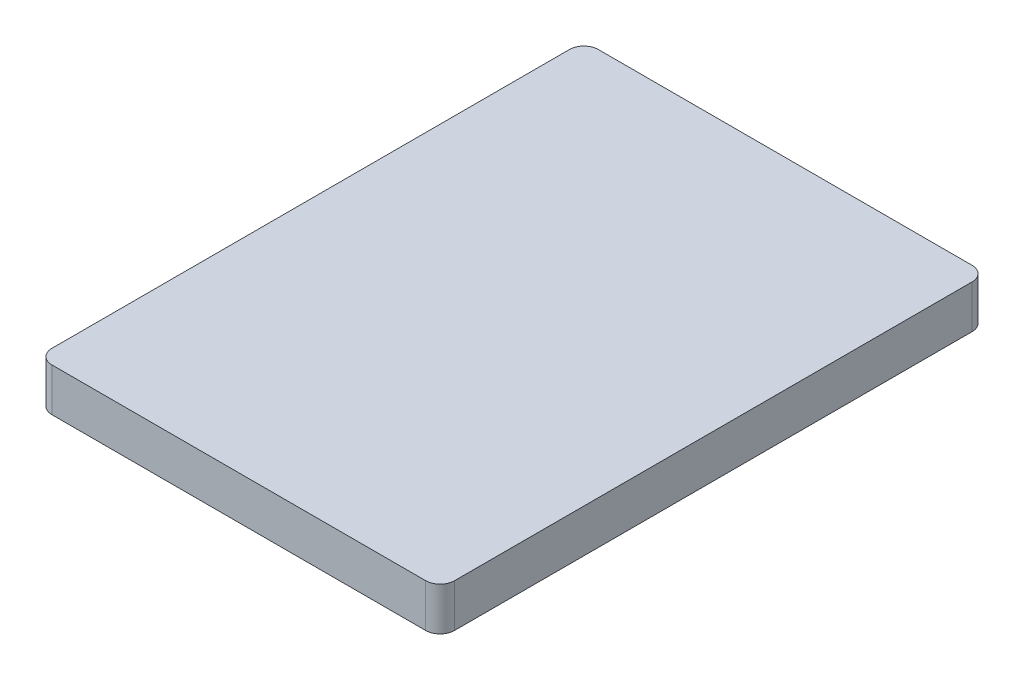
ISO-10303-21;
HEADER;
FILE_DESCRIPTION(('STEP AP214'),'2;1');
FILE_NAME('part.step','',(''),(''),'','','');
FILE_SCHEMA(('AUTOMOTIVE_DESIGN { 1 0 10303 214 1 1 1 1 }'));
ENDSEC;
DATA;
#1=APPLICATION_CONTEXT('core data for automotive mechanical design processes');
#2=APPLICATION_PROTOCOL_DEFINITION('international standard','automotive_design',2000,#1);
#3=PRODUCT_CONTEXT('',#1,'mechanical');
#4=PRODUCT('Part','Part','',(#3));
#5=PRODUCT_RELATED_PRODUCT_CATEGORY('part','',(#4));
#6=PRODUCT_DEFINITION_FORMATION('','',#4);
#7=PRODUCT_DEFINITION_CONTEXT('part definition',#1,'design');
#8=PRODUCT_DEFINITION('design','',#6,#7);
#9=PRODUCT_DEFINITION_SHAPE('','',#8);
#10=(LENGTH_UNIT() NAMED_UNIT(*) SI_UNIT(.MILLI.,.METRE.));
#11=(NAMED_UNIT(*) PLANE_ANGLE_UNIT() SI_UNIT($,.RADIAN.));
#12=(NAMED_UNIT(*) SI_UNIT($,.STERADIAN.) SOLID_ANGLE_UNIT());
#13=UNCERTAINTY_MEASURE_WITH_UNIT(LENGTH_MEASURE(1.E-05),#10,'distance_accuracy_value','');
#14=(GEOMETRIC_REPRESENTATION_CONTEXT(3) GLOBAL_UNCERTAINTY_ASSIGNED_CONTEXT((#13)) GLOBAL_UNIT_ASSIGNED_CONTEXT((#10,
#11,#12)) REPRESENTATION_CONTEXT('',''));
#15=CARTESIAN_POINT('',(0.,0.,0.));
#16=DIRECTION('',(0.,0.,1.));
#17=DIRECTION('',(1.,0.,0.));
#18=AXIS2_PLACEMENT_3D('',#15,#16,#17);
#19=CARTESIAN_POINT('',(0.,6.,76.));
#20=DIRECTION('',(1.,0.,0.));
#21=DIRECTION('',(0.,0.,-1.));
#22=AXIS2_PLACEMENT_3D('',#19,#20,#21);
#23=PLANE('',#22);
#24=DIRECTION('',(0.,0.,-1.));
#25=VECTOR('',#24,1.);
#26=CARTESIAN_POINT('',(0.,6.,76.));
#27=LINE('',#26,#25);
#28=CARTESIAN_POINT('',(0.,6.,74.));
#29=VERTEX_POINT('',#28);
#30=CARTESIAN_POINT('',(0.,6.,2.));
#31=VERTEX_POINT('',#30);
#32=EDGE_CURVE('E160',#29,#31,#27,.T.);
#33=ORIENTED_EDGE('',*,*,#32,.T.);
#34=DIRECTION('',(0.,-1.,0.));
#35=VECTOR('',#34,1.);
#36=CARTESIAN_POINT('',(0.,6.,2.));
#37=LINE('',#36,#35);
#38=CARTESIAN_POINT('',(0.,0.,2.));
#39=VERTEX_POINT('',#38);
#40=EDGE_CURVE('E124',#31,#39,#37,.T.);
#41=ORIENTED_EDGE('',*,*,#40,.T.);
#42=DIRECTION('',(0.,0.,-1.));
#43=VECTOR('',#42,1.);
#44=CARTESIAN_POINT('',(0.,0.,76.));
#45=LINE('',#44,#43);
#46=CARTESIAN_POINT('',(0.,0.,74.));
#47=VERTEX_POINT('',#46);
#48=EDGE_CURVE('E109',#47,#39,#45,.T.);
#49=ORIENTED_EDGE('',*,*,#48,.F.);
#50=DIRECTION('',(0.,-1.,0.));
#51=VECTOR('',#50,1.);
#52=CARTESIAN_POINT('',(0.,6.,74.));
#53=LINE('',#52,#51);
#54=EDGE_CURVE('E121',#47,#29,#53,.F.);
#55=ORIENTED_EDGE('',*,*,#54,.T.);
#56=EDGE_LOOP('',(#33,#41,#49,#55));
#57=FACE_BOUND('',#56,.T.);
#58=ADVANCED_FACE('F39',(#57),#23,.F.);
#59=CARTESIAN_POINT('',(0.,0.,76.));
#60=DIRECTION('',(0.,1.,0.));
#61=DIRECTION('',(0.,0.,1.));
#62=AXIS2_PLACEMENT_3D('',#59,#60,#61);
#63=PLANE('',#62);
#64=ORIENTED_EDGE('',*,*,#48,.T.);
#65=CARTESIAN_POINT('',(2.,0.,2.));
#66=DIRECTION('',(0.,1.,0.));
#67=DIRECTION('',(0.,0.,1.));
#68=AXIS2_PLACEMENT_3D('',#65,#66,#67);
#69=CIRCLE('',#68,2.);
#70=CARTESIAN_POINT('',(2.,0.,0.));
#71=VERTEX_POINT('',#70);
#72=EDGE_CURVE('E136',#39,#71,#69,.F.);
#73=ORIENTED_EDGE('',*,*,#72,.T.);
#74=DIRECTION('',(1.,0.,0.));
#75=VECTOR('',#74,1.);
#76=CARTESIAN_POINT('',(0.,0.,0.));
#77=LINE('',#76,#75);
#78=CARTESIAN_POINT('',(54.,0.,0.));
#79=VERTEX_POINT('',#78);
#80=EDGE_CURVE('E167',#71,#79,#77,.T.);
#81=ORIENTED_EDGE('',*,*,#80,.T.);
#82=CARTESIAN_POINT('',(54.,0.,2.));
#83=DIRECTION('',(0.,1.,0.));
#84=DIRECTION('',(0.,0.,1.));
#85=AXIS2_PLACEMENT_3D('',#82,#83,#84);
#86=CIRCLE('',#85,2.);
#87=CARTESIAN_POINT('',(56.,0.,2.));
#88=VERTEX_POINT('',#87);
#89=EDGE_CURVE('E115',#79,#88,#86,.F.);
#90=ORIENTED_EDGE('',*,*,#89,.T.);
#91=DIRECTION('',(0.,0.,-1.));
#92=VECTOR('',#91,1.);
#93=CARTESIAN_POINT('',(56.,0.,76.));
#94=LINE('',#93,#92);
#95=CARTESIAN_POINT('',(56.,0.,74.));
#96=VERTEX_POINT('',#95);
#97=EDGE_CURVE('E125',#96,#88,#94,.T.);
#98=ORIENTED_EDGE('',*,*,#97,.F.);
#99=CARTESIAN_POINT('',(54.,0.,74.));
#100=DIRECTION('',(0.,1.,0.));
#101=DIRECTION('',(0.,0.,1.));
#102=AXIS2_PLACEMENT_3D('',#99,#100,#101);
#103=CIRCLE('',#102,2.);
#104=CARTESIAN_POINT('',(54.,0.,76.));
#105=VERTEX_POINT('',#104);
#106=EDGE_CURVE('E116',#96,#105,#103,.F.);
#107=ORIENTED_EDGE('',*,*,#106,.T.);
#108=DIRECTION('',(1.,0.,0.));
#109=VECTOR('',#108,1.);
#110=CARTESIAN_POINT('',(0.,0.,76.));
#111=LINE('',#110,#109);
#112=CARTESIAN_POINT('',(2.,0.,76.));
#113=VERTEX_POINT('',#112);
#114=EDGE_CURVE('E111',#113,#105,#111,.T.);
#115=ORIENTED_EDGE('',*,*,#114,.F.);
#116=CARTESIAN_POINT('',(2.,0.,74.));
#117=DIRECTION('',(0.,1.,0.));
#118=DIRECTION('',(0.,0.,1.));
#119=AXIS2_PLACEMENT_3D('',#116,#117,#118);
#120=CIRCLE('',#119,2.);
#121=EDGE_CURVE('E106',#113,#47,#120,.F.);
#122=ORIENTED_EDGE('',*,*,#121,.T.);
#123=EDGE_LOOP('',(#64,#73,#81,#90,#98,#107,#115,#122));
#124=FACE_BOUND('',#123,.T.);
#125=ADVANCED_FACE('F108',(#124),#63,.F.);
#126=CARTESIAN_POINT('',(56.,0.,76.));
#127=DIRECTION('',(-1.,0.,0.));
#128=DIRECTION('',(0.,0.,1.));
#129=AXIS2_PLACEMENT_3D('',#126,#127,#128);
#130=PLANE('',#129);
#131=ORIENTED_EDGE('',*,*,#97,.T.);
#132=DIRECTION('',(0.,1.,0.));
#133=VECTOR('',#132,1.);
#134=CARTESIAN_POINT('',(56.,0.,2.));
#135=LINE('',#134,#133);
#136=CARTESIAN_POINT('',(56.,6.,2.));
#137=VERTEX_POINT('',#136);
#138=EDGE_CURVE('E149',#88,#137,#135,.T.);
#139=ORIENTED_EDGE('',*,*,#138,.T.);
#140=DIRECTION('',(0.,0.,-1.));
#141=VECTOR('',#140,1.);
#142=CARTESIAN_POINT('',(56.,6.,76.));
#143=LINE('',#142,#141);
#144=CARTESIAN_POINT('',(56.,6.,74.));
#145=VERTEX_POINT('',#144);
#146=EDGE_CURVE('E162',#145,#137,#143,.T.);
#147=ORIENTED_EDGE('',*,*,#146,.F.);
#148=DIRECTION('',(0.,1.,0.));
#149=VECTOR('',#148,1.);
#150=CARTESIAN_POINT('',(56.,0.,74.));
#151=LINE('',#150,#149);
#152=EDGE_CURVE('E147',#145,#96,#151,.F.);
#153=ORIENTED_EDGE('',*,*,#152,.T.);
#154=EDGE_LOOP('',(#131,#139,#147,#153));
#155=FACE_BOUND('',#154,.T.);
#156=ADVANCED_FACE('F174',(#155),#130,.F.);
#157=CARTESIAN_POINT('',(56.,6.,76.));
#158=DIRECTION('',(0.,-1.,0.));
#159=DIRECTION('',(0.,0.,-1.));
#160=AXIS2_PLACEMENT_3D('',#157,#158,#159);
#161=PLANE('',#160);
#162=DIRECTION('',(-1.,0.,0.));
#163=VECTOR('',#162,1.);
#164=CARTESIAN_POINT('',(56.,6.,0.));
#165=LINE('',#164,#163);
#166=CARTESIAN_POINT('',(54.,6.,0.));
#167=VERTEX_POINT('',#166);
#168=CARTESIAN_POINT('',(2.,6.,0.));
#169=VERTEX_POINT('',#168);
#170=EDGE_CURVE('E164',#167,#169,#165,.T.);
#171=ORIENTED_EDGE('',*,*,#170,.T.);
#172=CARTESIAN_POINT('',(2.,6.,2.));
#173=DIRECTION('',(0.,-1.,0.));
#174=DIRECTION('',(0.,0.,-1.));
#175=AXIS2_PLACEMENT_3D('',#172,#173,#174);
#176=CIRCLE('',#175,2.);
#177=EDGE_CURVE('E145',#169,#31,#176,.F.);
#178=ORIENTED_EDGE('',*,*,#177,.T.);
#179=ORIENTED_EDGE('',*,*,#32,.F.);
#180=CARTESIAN_POINT('',(2.,6.,74.));
#181=DIRECTION('',(0.,-1.,0.));
#182=DIRECTION('',(0.,0.,-1.));
#183=AXIS2_PLACEMENT_3D('',#180,#181,#182);
#184=CIRCLE('',#183,2.);
#185=CARTESIAN_POINT('',(2.,6.,76.));
#186=VERTEX_POINT('',#185);
#187=EDGE_CURVE('E129',#29,#186,#184,.F.);
#188=ORIENTED_EDGE('',*,*,#187,.T.);
#189=DIRECTION('',(-1.,0.,0.));
#190=VECTOR('',#189,1.);
#191=CARTESIAN_POINT('',(56.,6.,76.));
#192=LINE('',#191,#190);
#193=CARTESIAN_POINT('',(54.,6.,76.));
#194=VERTEX_POINT('',#193);
#195=EDGE_CURVE('E155',#194,#186,#192,.T.);
#196=ORIENTED_EDGE('',*,*,#195,.F.);
#197=CARTESIAN_POINT('',(54.,6.,74.));
#198=DIRECTION('',(0.,-1.,0.));
#199=DIRECTION('',(0.,0.,-1.));
#200=AXIS2_PLACEMENT_3D('',#197,#198,#199);
#201=CIRCLE('',#200,2.);
#202=EDGE_CURVE('E62',#194,#145,#201,.F.);
#203=ORIENTED_EDGE('',*,*,#202,.T.);
#204=ORIENTED_EDGE('',*,*,#146,.T.);
#205=CARTESIAN_POINT('',(54.,6.,2.));
#206=DIRECTION('',(0.,-1.,0.));
#207=DIRECTION('',(0.,0.,-1.));
#208=AXIS2_PLACEMENT_3D('',#205,#206,#207);
#209=CIRCLE('',#208,2.);
#210=EDGE_CURVE('E54',#137,#167,#209,.F.);
#211=ORIENTED_EDGE('',*,*,#210,.T.);
#212=EDGE_LOOP('',(#171,#178,#179,#188,#196,#203,#204,#211));
#213=FACE_BOUND('',#212,.T.);
#214=ADVANCED_FACE('F159',(#213),#161,.F.);
#215=CARTESIAN_POINT('',(0.,0.,76.));
#216=DIRECTION('',(0.,0.,1.));
#217=DIRECTION('',(1.,0.,0.));
#218=AXIS2_PLACEMENT_3D('',#215,#216,#217);
#219=PLANE('',#218);
#220=ORIENTED_EDGE('',*,*,#195,.T.);
#221=DIRECTION('',(0.,-1.,0.));
#222=VECTOR('',#221,1.);
#223=CARTESIAN_POINT('',(2.,0.,76.));
#224=LINE('',#223,#222);
#225=EDGE_CURVE('E11',#186,#113,#224,.T.);
#226=ORIENTED_EDGE('',*,*,#225,.T.);
#227=ORIENTED_EDGE('',*,*,#114,.T.);
#228=DIRECTION('',(0.,1.,0.));
#229=VECTOR('',#228,1.);
#230=CARTESIAN_POINT('',(54.,6.,76.));
#231=LINE('',#230,#229);
#232=EDGE_CURVE('E47',#105,#194,#231,.T.);
#233=ORIENTED_EDGE('',*,*,#232,.T.);
#234=EDGE_LOOP('',(#220,#226,#227,#233));
#235=FACE_BOUND('',#234,.T.);
#236=ADVANCED_FACE('F154',(#235),#219,.T.);
#237=CARTESIAN_POINT('',(0.,0.,0.));
#238=DIRECTION('',(0.,0.,1.));
#239=DIRECTION('',(1.,0.,0.));
#240=AXIS2_PLACEMENT_3D('',#237,#238,#239);
#241=PLANE('',#240);
#242=ORIENTED_EDGE('',*,*,#80,.F.);
#243=DIRECTION('',(0.,-1.,0.));
#244=VECTOR('',#243,1.);
#245=CARTESIAN_POINT('',(2.,0.,0.));
#246=LINE('',#245,#244);
#247=EDGE_CURVE('E140',#71,#169,#246,.F.);
#248=ORIENTED_EDGE('',*,*,#247,.T.);
#249=ORIENTED_EDGE('',*,*,#170,.F.);
#250=DIRECTION('',(0.,1.,0.));
#251=VECTOR('',#250,1.);
#252=CARTESIAN_POINT('',(54.,0.,0.));
#253=LINE('',#252,#251);
#254=EDGE_CURVE('E138',#167,#79,#253,.F.);
#255=ORIENTED_EDGE('',*,*,#254,.T.);
#256=EDGE_LOOP('',(#242,#248,#249,#255));
#257=FACE_BOUND('',#256,.T.);
#258=ADVANCED_FACE('F181',(#257),#241,.F.);
#259=CARTESIAN_POINT('',(2.,6.,2.));
#260=DIRECTION('',(0.,-1.,0.));
#261=DIRECTION('',(0.,0.,-1.));
#262=AXIS2_PLACEMENT_3D('',#259,#260,#261);
#263=CYLINDRICAL_SURFACE('',#262,2.);
#264=ORIENTED_EDGE('',*,*,#177,.F.);
#265=ORIENTED_EDGE('',*,*,#247,.F.);
#266=ORIENTED_EDGE('',*,*,#72,.F.);
#267=ORIENTED_EDGE('',*,*,#40,.F.);
#268=EDGE_LOOP('',(#264,#265,#266,#267));
#269=FACE_BOUND('',#268,.T.);
#270=ADVANCED_FACE('F185',(#269),#263,.T.);
#271=CARTESIAN_POINT('',(54.,0.,2.));
#272=DIRECTION('',(0.,1.,0.));
#273=DIRECTION('',(0.,0.,1.));
#274=AXIS2_PLACEMENT_3D('',#271,#272,#273);
#275=CYLINDRICAL_SURFACE('',#274,2.);
#276=ORIENTED_EDGE('',*,*,#89,.F.);
#277=ORIENTED_EDGE('',*,*,#254,.F.);
#278=ORIENTED_EDGE('',*,*,#210,.F.);
#279=ORIENTED_EDGE('',*,*,#138,.F.);
#280=EDGE_LOOP('',(#276,#277,#278,#279));
#281=FACE_BOUND('',#280,.T.);
#282=ADVANCED_FACE('F177',(#281),#275,.T.);
#283=CARTESIAN_POINT('',(2.,0.,74.));
#284=DIRECTION('',(0.,1.,0.));
#285=DIRECTION('',(0.,0.,1.));
#286=AXIS2_PLACEMENT_3D('',#283,#284,#285);
#287=CYLINDRICAL_SURFACE('',#286,2.);
#288=ORIENTED_EDGE('',*,*,#187,.F.);
#289=ORIENTED_EDGE('',*,*,#54,.F.);
#290=ORIENTED_EDGE('',*,*,#121,.F.);
#291=ORIENTED_EDGE('',*,*,#225,.F.);
#292=EDGE_LOOP('',(#288,#289,#290,#291));
#293=FACE_BOUND('',#292,.T.);
#294=ADVANCED_FACE('F128',(#293),#287,.T.);
#295=CARTESIAN_POINT('',(54.,0.,74.));
#296=DIRECTION('',(0.,-1.,0.));
#297=DIRECTION('',(0.,0.,-1.));
#298=AXIS2_PLACEMENT_3D('',#295,#296,#297);
#299=CYLINDRICAL_SURFACE('',#298,2.);
#300=ORIENTED_EDGE('',*,*,#106,.F.);
#301=ORIENTED_EDGE('',*,*,#152,.F.);
#302=ORIENTED_EDGE('',*,*,#202,.F.);
#303=ORIENTED_EDGE('',*,*,#232,.F.);
#304=EDGE_LOOP('',(#300,#301,#302,#303));
#305=FACE_BOUND('',#304,.T.);
#306=ADVANCED_FACE('F41',(#305),#299,.T.);
#307=CLOSED_SHELL('',(#58,#125,#156,#214,#236,#258,#270,#282,#294,#306));
#308=MANIFOLD_SOLID_BREP('B2',#307);
#309=ADVANCED_BREP_SHAPE_REPRESENTATION('',(#18,#308),#14);
#310=SHAPE_DEFINITION_REPRESENTATION(#9,#309);
ENDSEC;
END-ISO-10303-21;
